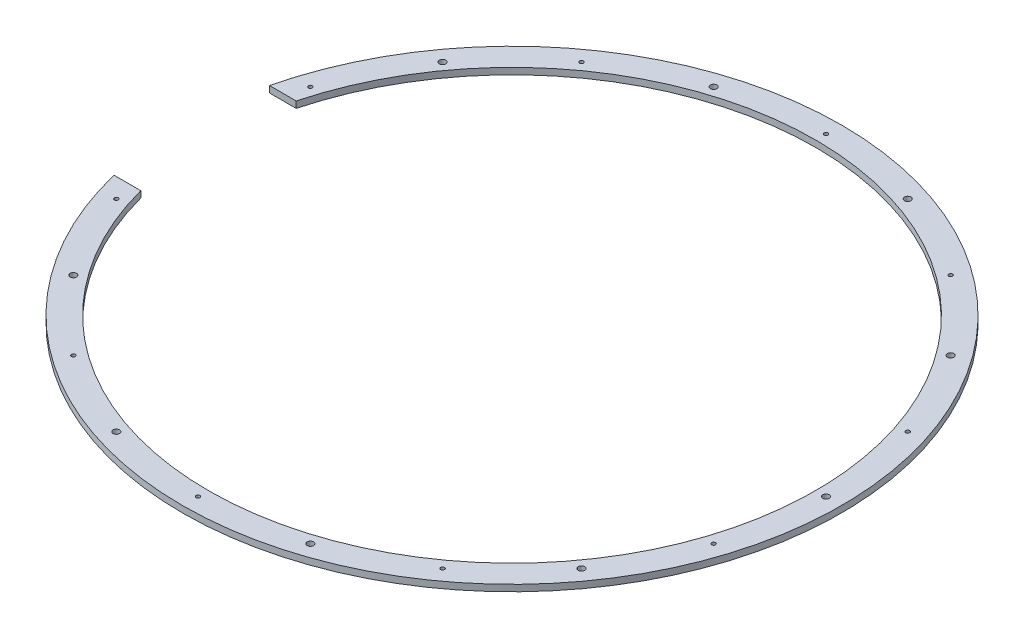
ISO-10303-21;
HEADER;
FILE_DESCRIPTION(('STEP AP214'),'2;1');
FILE_NAME('part.step','',(''),(''),'','','');
FILE_SCHEMA(('AUTOMOTIVE_DESIGN { 1 0 10303 214 1 1 1 1 }'));
ENDSEC;
DATA;
#1=APPLICATION_CONTEXT('core data for automotive mechanical design processes');
#2=APPLICATION_PROTOCOL_DEFINITION('international standard','automotive_design',2000,#1);
#3=PRODUCT_CONTEXT('',#1,'mechanical');
#4=PRODUCT('Part','Part','',(#3));
#5=PRODUCT_RELATED_PRODUCT_CATEGORY('part','',(#4));
#6=PRODUCT_DEFINITION_FORMATION('','',#4);
#7=PRODUCT_DEFINITION_CONTEXT('part definition',#1,'design');
#8=PRODUCT_DEFINITION('design','',#6,#7);
#9=PRODUCT_DEFINITION_SHAPE('','',#8);
#10=(LENGTH_UNIT() NAMED_UNIT(*) SI_UNIT(.MILLI.,.METRE.));
#11=(NAMED_UNIT(*) PLANE_ANGLE_UNIT() SI_UNIT($,.RADIAN.));
#12=(NAMED_UNIT(*) SI_UNIT($,.STERADIAN.) SOLID_ANGLE_UNIT());
#13=UNCERTAINTY_MEASURE_WITH_UNIT(LENGTH_MEASURE(1.E-05),#10,'distance_accuracy_value','');
#14=(GEOMETRIC_REPRESENTATION_CONTEXT(3) GLOBAL_UNCERTAINTY_ASSIGNED_CONTEXT((#13)) GLOBAL_UNIT_ASSIGNED_CONTEXT((#10,
#11,#12)) REPRESENTATION_CONTEXT('',''));
#15=CARTESIAN_POINT('',(0.,0.,0.));
#16=DIRECTION('',(0.,0.,1.));
#17=DIRECTION('',(1.,0.,0.));
#18=AXIS2_PLACEMENT_3D('',#15,#16,#17);
#19=CARTESIAN_POINT('',(0.,5.,0.));
#20=DIRECTION('',(0.,1.,0.));
#21=DIRECTION('',(0.,0.,1.));
#22=AXIS2_PLACEMENT_3D('',#19,#20,#21);
#23=PLANE('',#22);
#24=CARTESIAN_POINT('',(1.32132478297511E-11,5.,242.50000000001));
#25=DIRECTION('',(0.,1.,0.));
#26=DIRECTION('',(0.,0.,1.));
#27=AXIS2_PLACEMENT_3D('',#24,#25,#26);
#28=CIRCLE('',#27,1.49999999999059);
#29=CARTESIAN_POINT('',(1.32132478297511E-11,5.,244.));
#30=VERTEX_POINT('',#29);
#31=EDGE_CURVE('E206',#30,#30,#28,.T.);
#32=ORIENTED_EDGE('',*,*,#31,.F.);
#33=EDGE_LOOP('',(#32));
#34=FACE_BOUND('',#33,.T.);
#35=CARTESIAN_POINT('',(142.537923680936,5.,196.186621135929));
#36=DIRECTION('',(0.,1.,0.));
#37=DIRECTION('',(0.,0.,1.));
#38=AXIS2_PLACEMENT_3D('',#35,#36,#37);
#39=CIRCLE('',#38,1.4999999999906);
#40=CARTESIAN_POINT('',(142.537923680936,5.,197.686621135919));
#41=VERTEX_POINT('',#40);
#42=EDGE_CURVE('E161',#41,#41,#39,.T.);
#43=ORIENTED_EDGE('',*,*,#42,.F.);
#44=EDGE_LOOP('',(#43));
#45=FACE_BOUND('',#44,.T.);
#46=CARTESIAN_POINT('',(230.631205201581,5.,74.9366211359248));
#47=DIRECTION('',(0.,1.,0.));
#48=DIRECTION('',(0.,0.,1.));
#49=AXIS2_PLACEMENT_3D('',#46,#47,#48);
#50=CIRCLE('',#49,1.49999999999414);
#51=CARTESIAN_POINT('',(230.631205201581,5.,76.4366211359189));
#52=VERTEX_POINT('',#51);
#53=EDGE_CURVE('E160',#52,#52,#50,.T.);
#54=ORIENTED_EDGE('',*,*,#53,.F.);
#55=EDGE_LOOP('',(#54));
#56=FACE_BOUND('',#55,.T.);
#57=CARTESIAN_POINT('',(230.631205201575,5.,-74.9366211359248));
#58=DIRECTION('',(0.,1.,0.));
#59=DIRECTION('',(0.,0.,1.));
#60=AXIS2_PLACEMENT_3D('',#57,#58,#59);
#61=CIRCLE('',#60,1.5);
#62=CARTESIAN_POINT('',(230.631205201575,5.,-73.4366211359248));
#63=VERTEX_POINT('',#62);
#64=EDGE_CURVE('E167',#63,#63,#61,.T.);
#65=ORIENTED_EDGE('',*,*,#64,.F.);
#66=EDGE_LOOP('',(#65));
#67=FACE_BOUND('',#66,.T.);
#68=CARTESIAN_POINT('',(142.53792368092,5.,-196.186621135921));
#69=DIRECTION('',(0.,1.,0.));
#70=DIRECTION('',(0.,0.,1.));
#71=AXIS2_PLACEMENT_3D('',#68,#69,#70);
#72=CIRCLE('',#71,1.50000000000597);
#73=CARTESIAN_POINT('',(142.53792368092,5.,-194.686621135915));
#74=VERTEX_POINT('',#73);
#75=EDGE_CURVE('E173',#74,#74,#72,.T.);
#76=ORIENTED_EDGE('',*,*,#75,.F.);
#77=EDGE_LOOP('',(#76));
#78=FACE_BOUND('',#77,.T.);
#79=CARTESIAN_POINT('',(-7.07926561869708E-12,5.,-242.499999999991));
#80=DIRECTION('',(0.,1.,0.));
#81=DIRECTION('',(0.,0.,1.));
#82=AXIS2_PLACEMENT_3D('',#79,#80,#81);
#83=CIRCLE('',#82,1.50000000000972);
#84=CARTESIAN_POINT('',(-7.07926561869708E-12,5.,-240.999999999981));
#85=VERTEX_POINT('',#84);
#86=EDGE_CURVE('E179',#85,#85,#83,.T.);
#87=ORIENTED_EDGE('',*,*,#86,.F.);
#88=EDGE_LOOP('',(#87));
#89=FACE_BOUND('',#88,.T.);
#90=CARTESIAN_POINT('',(-142.53792368093,5.,-196.186621135909));
#91=DIRECTION('',(0.,1.,0.));
#92=DIRECTION('',(0.,0.,1.));
#93=AXIS2_PLACEMENT_3D('',#90,#91,#92);
#94=CIRCLE('',#93,1.50000000000975);
#95=CARTESIAN_POINT('',(-142.53792368093,5.,-194.6866211359));
#96=VERTEX_POINT('',#95);
#97=EDGE_CURVE('E185',#96,#96,#94,.T.);
#98=ORIENTED_EDGE('',*,*,#97,.F.);
#99=EDGE_LOOP('',(#98));
#100=FACE_BOUND('',#99,.T.);
#101=CARTESIAN_POINT('',(-230.631205201575,5.,-74.9366211359056));
#102=DIRECTION('',(0.,1.,0.));
#103=DIRECTION('',(0.,0.,1.));
#104=AXIS2_PLACEMENT_3D('',#101,#102,#103);
#105=CIRCLE('',#104,1.50000000000615);
#106=CARTESIAN_POINT('',(-230.631205201575,5.,-73.4366211358995));
#107=VERTEX_POINT('',#106);
#108=EDGE_CURVE('E191',#107,#107,#105,.T.);
#109=ORIENTED_EDGE('',*,*,#108,.F.);
#110=EDGE_LOOP('',(#109));
#111=FACE_BOUND('',#110,.T.);
#112=CARTESIAN_POINT('',(-230.631205201569,5.,74.936621135944));
#113=DIRECTION('',(0.,1.,0.));
#114=DIRECTION('',(0.,0.,1.));
#115=AXIS2_PLACEMENT_3D('',#112,#113,#114);
#116=CIRCLE('',#115,1.50000000000033);
#117=CARTESIAN_POINT('',(-230.631205201569,5.,76.4366211359443));
#118=VERTEX_POINT('',#117);
#119=EDGE_CURVE('E197',#118,#118,#116,.T.);
#120=ORIENTED_EDGE('',*,*,#119,.F.);
#121=EDGE_LOOP('',(#120));
#122=FACE_BOUND('',#121,.T.);
#123=CARTESIAN_POINT('',(-142.537923680914,5.,196.18662113594));
#124=DIRECTION('',(0.,1.,0.));
#125=DIRECTION('',(0.,0.,1.));
#126=AXIS2_PLACEMENT_3D('',#123,#124,#125);
#127=CIRCLE('',#126,1.49999999999442);
#128=CARTESIAN_POINT('',(-142.537923680914,5.,197.686621135935));
#129=VERTEX_POINT('',#128);
#130=EDGE_CURVE('E203',#129,#129,#127,.T.);
#131=ORIENTED_EDGE('',*,*,#130,.F.);
#132=EDGE_LOOP('',(#131));
#133=FACE_BOUND('',#132,.T.);
#134=CARTESIAN_POINT('',(242.5,5.,0.));
#135=DIRECTION('',(0.,1.,0.));
#136=DIRECTION('',(0.,0.,1.));
#137=AXIS2_PLACEMENT_3D('',#134,#135,#136);
#138=CIRCLE('',#137,2.5);
#139=CARTESIAN_POINT('',(242.5,5.,2.5));
#140=VERTEX_POINT('',#139);
#141=EDGE_CURVE('E146',#140,#140,#138,.T.);
#142=ORIENTED_EDGE('',*,*,#141,.F.);
#143=EDGE_LOOP('',(#142));
#144=FACE_BOUND('',#143,.T.);
#145=CARTESIAN_POINT('',(196.186621135925,5.,-142.537923680925));
#146=DIRECTION('',(0.,1.,0.));
#147=DIRECTION('',(0.,0.,1.));
#148=AXIS2_PLACEMENT_3D('',#145,#146,#147);
#149=CIRCLE('',#148,2.5);
#150=CARTESIAN_POINT('',(196.186621135925,5.,-140.037923680925));
#151=VERTEX_POINT('',#150);
#152=EDGE_CURVE('E147',#151,#151,#149,.T.);
#153=ORIENTED_EDGE('',*,*,#152,.F.);
#154=EDGE_LOOP('',(#153));
#155=FACE_BOUND('',#154,.T.);
#156=CARTESIAN_POINT('',(74.9366211359247,5.,-230.631205201575));
#157=DIRECTION('',(0.,1.,0.));
#158=DIRECTION('',(0.,0.,1.));
#159=AXIS2_PLACEMENT_3D('',#156,#157,#158);
#160=CIRCLE('',#159,2.50000000000001);
#161=CARTESIAN_POINT('',(74.9366211359247,5.,-228.131205201575));
#162=VERTEX_POINT('',#161);
#163=EDGE_CURVE('E103',#162,#162,#160,.T.);
#164=ORIENTED_EDGE('',*,*,#163,.F.);
#165=EDGE_LOOP('',(#164));
#166=FACE_BOUND('',#165,.T.);
#167=CARTESIAN_POINT('',(-74.9366211359248,5.,-230.631205201575));
#168=DIRECTION('',(0.,1.,0.));
#169=DIRECTION('',(0.,0.,1.));
#170=AXIS2_PLACEMENT_3D('',#167,#168,#169);
#171=CIRCLE('',#170,2.5);
#172=CARTESIAN_POINT('',(-74.9366211359248,5.,-228.131205201575));
#173=VERTEX_POINT('',#172);
#174=EDGE_CURVE('E110',#173,#173,#171,.T.);
#175=ORIENTED_EDGE('',*,*,#174,.F.);
#176=EDGE_LOOP('',(#175));
#177=FACE_BOUND('',#176,.T.);
#178=CARTESIAN_POINT('',(-196.186621135925,5.,-142.537923680925));
#179=DIRECTION('',(0.,1.,0.));
#180=DIRECTION('',(0.,0.,1.));
#181=AXIS2_PLACEMENT_3D('',#178,#179,#180);
#182=CIRCLE('',#181,2.5);
#183=CARTESIAN_POINT('',(-196.186621135925,5.,-140.037923680925));
#184=VERTEX_POINT('',#183);
#185=EDGE_CURVE('E116',#184,#184,#182,.T.);
#186=ORIENTED_EDGE('',*,*,#185,.F.);
#187=EDGE_LOOP('',(#186));
#188=FACE_BOUND('',#187,.T.);
#189=CARTESIAN_POINT('',(-196.186621135925,5.,142.537923680925));
#190=DIRECTION('',(0.,1.,0.));
#191=DIRECTION('',(0.,0.,1.));
#192=AXIS2_PLACEMENT_3D('',#189,#190,#191);
#193=CIRCLE('',#192,2.5);
#194=CARTESIAN_POINT('',(-196.186621135925,5.,145.037923680925));
#195=VERTEX_POINT('',#194);
#196=EDGE_CURVE('E122',#195,#195,#193,.T.);
#197=ORIENTED_EDGE('',*,*,#196,.F.);
#198=EDGE_LOOP('',(#197));
#199=FACE_BOUND('',#198,.T.);
#200=CARTESIAN_POINT('',(-74.9366211359248,5.,230.631205201575));
#201=DIRECTION('',(0.,1.,0.));
#202=DIRECTION('',(0.,0.,1.));
#203=AXIS2_PLACEMENT_3D('',#200,#201,#202);
#204=CIRCLE('',#203,2.5);
#205=CARTESIAN_POINT('',(-74.9366211359248,5.,233.131205201575));
#206=VERTEX_POINT('',#205);
#207=EDGE_CURVE('E128',#206,#206,#204,.T.);
#208=ORIENTED_EDGE('',*,*,#207,.F.);
#209=EDGE_LOOP('',(#208));
#210=FACE_BOUND('',#209,.T.);
#211=CARTESIAN_POINT('',(74.9366211359247,5.,230.631205201575));
#212=DIRECTION('',(0.,1.,0.));
#213=DIRECTION('',(0.,0.,1.));
#214=AXIS2_PLACEMENT_3D('',#211,#212,#213);
#215=CIRCLE('',#214,2.49999999999998);
#216=CARTESIAN_POINT('',(74.9366211359247,5.,233.131205201575));
#217=VERTEX_POINT('',#216);
#218=EDGE_CURVE('E134',#217,#217,#215,.T.);
#219=ORIENTED_EDGE('',*,*,#218,.F.);
#220=EDGE_LOOP('',(#219));
#221=FACE_BOUND('',#220,.T.);
#222=CARTESIAN_POINT('',(196.186621135925,5.,142.537923680925));
#223=DIRECTION('',(0.,1.,0.));
#224=DIRECTION('',(0.,0.,1.));
#225=AXIS2_PLACEMENT_3D('',#222,#223,#224);
#226=CIRCLE('',#225,2.50000000000002);
#227=CARTESIAN_POINT('',(196.186621135925,5.,145.037923680925));
#228=VERTEX_POINT('',#227);
#229=EDGE_CURVE('E140',#228,#228,#226,.T.);
#230=ORIENTED_EDGE('',*,*,#229,.F.);
#231=EDGE_LOOP('',(#230));
#232=FACE_BOUND('',#231,.T.);
#233=CARTESIAN_POINT('',(0.,5.,0.));
#234=DIRECTION('',(0.,1.,0.));
#235=DIRECTION('',(0.,0.,1.));
#236=AXIS2_PLACEMENT_3D('',#233,#234,#235);
#237=CIRCLE('',#236,234.5);
#238=CARTESIAN_POINT('',(-226.694177252086,5.,60.));
#239=VERTEX_POINT('',#238);
#240=CARTESIAN_POINT('',(-226.694177252086,5.,-60.));
#241=VERTEX_POINT('',#240);
#242=EDGE_CURVE('E87',#239,#241,#237,.T.);
#243=ORIENTED_EDGE('',*,*,#242,.F.);
#244=DIRECTION('',(-1.,0.,0.));
#245=VECTOR('',#244,1.);
#246=CARTESIAN_POINT('',(-226.694177252086,5.,60.));
#247=LINE('',#246,#245);
#248=CARTESIAN_POINT('',(-247.326201604278,5.,60.));
#249=VERTEX_POINT('',#248);
#250=EDGE_CURVE('E48',#239,#249,#247,.T.);
#251=ORIENTED_EDGE('',*,*,#250,.T.);
#252=CARTESIAN_POINT('',(0.,5.,0.));
#253=DIRECTION('',(0.,1.,0.));
#254=DIRECTION('',(0.,0.,1.));
#255=AXIS2_PLACEMENT_3D('',#252,#253,#254);
#256=CIRCLE('',#255,254.5);
#257=CARTESIAN_POINT('',(-247.326201604278,5.,-60.));
#258=VERTEX_POINT('',#257);
#259=EDGE_CURVE('E11',#249,#258,#256,.T.);
#260=ORIENTED_EDGE('',*,*,#259,.T.);
#261=DIRECTION('',(-1.,0.,0.));
#262=VECTOR('',#261,1.);
#263=CARTESIAN_POINT('',(-226.694177252086,5.,-60.));
#264=LINE('',#263,#262);
#265=EDGE_CURVE('E96',#241,#258,#264,.T.);
#266=ORIENTED_EDGE('',*,*,#265,.F.);
#267=EDGE_LOOP('',(#243,#251,#260,#266));
#268=FACE_BOUND('',#267,.T.);
#269=ADVANCED_FACE('F33',(#34,#45,#56,#67,#78,#89,#100,#111,#122,#133,#144,#155,#166,#177,#188,
#199,#210,#221,#232,#268),#23,.T.);
#270=CARTESIAN_POINT('',(0.,0.,0.));
#271=DIRECTION('',(0.,1.,0.));
#272=DIRECTION('',(0.,0.,1.));
#273=AXIS2_PLACEMENT_3D('',#270,#271,#272);
#274=PLANE('',#273);
#275=CARTESIAN_POINT('',(1.32132478297511E-11,0.,242.50000000001));
#276=DIRECTION('',(0.,1.,0.));
#277=DIRECTION('',(0.,0.,1.));
#278=AXIS2_PLACEMENT_3D('',#275,#276,#277);
#279=CIRCLE('',#278,1.49999999999059);
#280=CARTESIAN_POINT('',(1.32132478297511E-11,0.,244.));
#281=VERTEX_POINT('',#280);
#282=EDGE_CURVE('E150',#281,#281,#279,.T.);
#283=ORIENTED_EDGE('',*,*,#282,.T.);
#284=EDGE_LOOP('',(#283));
#285=FACE_BOUND('',#284,.T.);
#286=CARTESIAN_POINT('',(142.537923680936,0.,196.186621135929));
#287=DIRECTION('',(0.,1.,0.));
#288=DIRECTION('',(0.,0.,1.));
#289=AXIS2_PLACEMENT_3D('',#286,#287,#288);
#290=CIRCLE('',#289,1.4999999999906);
#291=CARTESIAN_POINT('',(142.537923680936,0.,197.686621135919));
#292=VERTEX_POINT('',#291);
#293=EDGE_CURVE('E207',#292,#292,#290,.T.);
#294=ORIENTED_EDGE('',*,*,#293,.T.);
#295=EDGE_LOOP('',(#294));
#296=FACE_BOUND('',#295,.T.);
#297=CARTESIAN_POINT('',(230.631205201581,0.,74.9366211359248));
#298=DIRECTION('',(0.,1.,0.));
#299=DIRECTION('',(0.,0.,1.));
#300=AXIS2_PLACEMENT_3D('',#297,#298,#299);
#301=CIRCLE('',#300,1.49999999999414);
#302=CARTESIAN_POINT('',(230.631205201581,0.,76.4366211359189));
#303=VERTEX_POINT('',#302);
#304=EDGE_CURVE('E157',#303,#303,#301,.T.);
#305=ORIENTED_EDGE('',*,*,#304,.T.);
#306=EDGE_LOOP('',(#305));
#307=FACE_BOUND('',#306,.T.);
#308=CARTESIAN_POINT('',(230.631205201575,0.,-74.9366211359248));
#309=DIRECTION('',(0.,1.,0.));
#310=DIRECTION('',(0.,0.,1.));
#311=AXIS2_PLACEMENT_3D('',#308,#309,#310);
#312=CIRCLE('',#311,1.5);
#313=CARTESIAN_POINT('',(230.631205201575,0.,-73.4366211359248));
#314=VERTEX_POINT('',#313);
#315=EDGE_CURVE('E164',#314,#314,#312,.T.);
#316=ORIENTED_EDGE('',*,*,#315,.T.);
#317=EDGE_LOOP('',(#316));
#318=FACE_BOUND('',#317,.T.);
#319=CARTESIAN_POINT('',(142.53792368092,0.,-196.186621135921));
#320=DIRECTION('',(0.,1.,0.));
#321=DIRECTION('',(0.,0.,1.));
#322=AXIS2_PLACEMENT_3D('',#319,#320,#321);
#323=CIRCLE('',#322,1.50000000000597);
#324=CARTESIAN_POINT('',(142.53792368092,0.,-194.686621135915));
#325=VERTEX_POINT('',#324);
#326=EDGE_CURVE('E170',#325,#325,#323,.T.);
#327=ORIENTED_EDGE('',*,*,#326,.T.);
#328=EDGE_LOOP('',(#327));
#329=FACE_BOUND('',#328,.T.);
#330=CARTESIAN_POINT('',(-7.07926561869708E-12,0.,-242.499999999991));
#331=DIRECTION('',(0.,1.,0.));
#332=DIRECTION('',(0.,0.,1.));
#333=AXIS2_PLACEMENT_3D('',#330,#331,#332);
#334=CIRCLE('',#333,1.50000000000972);
#335=CARTESIAN_POINT('',(-7.07926561869708E-12,0.,-240.999999999981));
#336=VERTEX_POINT('',#335);
#337=EDGE_CURVE('E176',#336,#336,#334,.T.);
#338=ORIENTED_EDGE('',*,*,#337,.T.);
#339=EDGE_LOOP('',(#338));
#340=FACE_BOUND('',#339,.T.);
#341=CARTESIAN_POINT('',(-142.53792368093,0.,-196.186621135909));
#342=DIRECTION('',(0.,1.,0.));
#343=DIRECTION('',(0.,0.,1.));
#344=AXIS2_PLACEMENT_3D('',#341,#342,#343);
#345=CIRCLE('',#344,1.50000000000975);
#346=CARTESIAN_POINT('',(-142.53792368093,0.,-194.6866211359));
#347=VERTEX_POINT('',#346);
#348=EDGE_CURVE('E182',#347,#347,#345,.T.);
#349=ORIENTED_EDGE('',*,*,#348,.T.);
#350=EDGE_LOOP('',(#349));
#351=FACE_BOUND('',#350,.T.);
#352=CARTESIAN_POINT('',(-230.631205201575,0.,-74.9366211359056));
#353=DIRECTION('',(0.,1.,0.));
#354=DIRECTION('',(0.,0.,1.));
#355=AXIS2_PLACEMENT_3D('',#352,#353,#354);
#356=CIRCLE('',#355,1.50000000000615);
#357=CARTESIAN_POINT('',(-230.631205201575,0.,-73.4366211358995));
#358=VERTEX_POINT('',#357);
#359=EDGE_CURVE('E188',#358,#358,#356,.T.);
#360=ORIENTED_EDGE('',*,*,#359,.T.);
#361=EDGE_LOOP('',(#360));
#362=FACE_BOUND('',#361,.T.);
#363=CARTESIAN_POINT('',(-230.631205201569,0.,74.936621135944));
#364=DIRECTION('',(0.,1.,0.));
#365=DIRECTION('',(0.,0.,1.));
#366=AXIS2_PLACEMENT_3D('',#363,#364,#365);
#367=CIRCLE('',#366,1.50000000000033);
#368=CARTESIAN_POINT('',(-230.631205201569,0.,76.4366211359443));
#369=VERTEX_POINT('',#368);
#370=EDGE_CURVE('E194',#369,#369,#367,.T.);
#371=ORIENTED_EDGE('',*,*,#370,.T.);
#372=EDGE_LOOP('',(#371));
#373=FACE_BOUND('',#372,.T.);
#374=CARTESIAN_POINT('',(-142.537923680914,0.,196.18662113594));
#375=DIRECTION('',(0.,1.,0.));
#376=DIRECTION('',(0.,0.,1.));
#377=AXIS2_PLACEMENT_3D('',#374,#375,#376);
#378=CIRCLE('',#377,1.49999999999442);
#379=CARTESIAN_POINT('',(-142.537923680914,0.,197.686621135935));
#380=VERTEX_POINT('',#379);
#381=EDGE_CURVE('E200',#380,#380,#378,.T.);
#382=ORIENTED_EDGE('',*,*,#381,.T.);
#383=EDGE_LOOP('',(#382));
#384=FACE_BOUND('',#383,.T.);
#385=CARTESIAN_POINT('',(242.5,0.,0.));
#386=DIRECTION('',(0.,1.,0.));
#387=DIRECTION('',(0.,0.,1.));
#388=AXIS2_PLACEMENT_3D('',#385,#386,#387);
#389=CIRCLE('',#388,2.5);
#390=CARTESIAN_POINT('',(242.5,0.,2.5));
#391=VERTEX_POINT('',#390);
#392=EDGE_CURVE('E101',#391,#391,#389,.T.);
#393=ORIENTED_EDGE('',*,*,#392,.T.);
#394=EDGE_LOOP('',(#393));
#395=FACE_BOUND('',#394,.T.);
#396=CARTESIAN_POINT('',(196.186621135925,0.,-142.537923680925));
#397=DIRECTION('',(0.,1.,0.));
#398=DIRECTION('',(0.,0.,1.));
#399=AXIS2_PLACEMENT_3D('',#396,#397,#398);
#400=CIRCLE('',#399,2.5);
#401=CARTESIAN_POINT('',(196.186621135925,0.,-140.037923680925));
#402=VERTEX_POINT('',#401);
#403=EDGE_CURVE('E107',#402,#402,#400,.T.);
#404=ORIENTED_EDGE('',*,*,#403,.T.);
#405=EDGE_LOOP('',(#404));
#406=FACE_BOUND('',#405,.T.);
#407=CARTESIAN_POINT('',(74.9366211359247,0.,-230.631205201575));
#408=DIRECTION('',(0.,1.,0.));
#409=DIRECTION('',(0.,0.,1.));
#410=AXIS2_PLACEMENT_3D('',#407,#408,#409);
#411=CIRCLE('',#410,2.50000000000001);
#412=CARTESIAN_POINT('',(74.9366211359247,0.,-228.131205201575));
#413=VERTEX_POINT('',#412);
#414=EDGE_CURVE('E106',#413,#413,#411,.T.);
#415=ORIENTED_EDGE('',*,*,#414,.T.);
#416=EDGE_LOOP('',(#415));
#417=FACE_BOUND('',#416,.T.);
#418=CARTESIAN_POINT('',(-74.9366211359248,0.,-230.631205201575));
#419=DIRECTION('',(0.,1.,0.));
#420=DIRECTION('',(0.,0.,1.));
#421=AXIS2_PLACEMENT_3D('',#418,#419,#420);
#422=CIRCLE('',#421,2.5);
#423=CARTESIAN_POINT('',(-74.9366211359248,0.,-228.131205201575));
#424=VERTEX_POINT('',#423);
#425=EDGE_CURVE('E113',#424,#424,#422,.T.);
#426=ORIENTED_EDGE('',*,*,#425,.T.);
#427=EDGE_LOOP('',(#426));
#428=FACE_BOUND('',#427,.T.);
#429=CARTESIAN_POINT('',(-196.186621135925,0.,-142.537923680925));
#430=DIRECTION('',(0.,1.,0.));
#431=DIRECTION('',(0.,0.,1.));
#432=AXIS2_PLACEMENT_3D('',#429,#430,#431);
#433=CIRCLE('',#432,2.5);
#434=CARTESIAN_POINT('',(-196.186621135925,0.,-140.037923680925));
#435=VERTEX_POINT('',#434);
#436=EDGE_CURVE('E119',#435,#435,#433,.T.);
#437=ORIENTED_EDGE('',*,*,#436,.T.);
#438=EDGE_LOOP('',(#437));
#439=FACE_BOUND('',#438,.T.);
#440=CARTESIAN_POINT('',(-196.186621135925,0.,142.537923680925));
#441=DIRECTION('',(0.,1.,0.));
#442=DIRECTION('',(0.,0.,1.));
#443=AXIS2_PLACEMENT_3D('',#440,#441,#442);
#444=CIRCLE('',#443,2.5);
#445=CARTESIAN_POINT('',(-196.186621135925,0.,145.037923680925));
#446=VERTEX_POINT('',#445);
#447=EDGE_CURVE('E125',#446,#446,#444,.T.);
#448=ORIENTED_EDGE('',*,*,#447,.T.);
#449=EDGE_LOOP('',(#448));
#450=FACE_BOUND('',#449,.T.);
#451=CARTESIAN_POINT('',(-74.9366211359248,0.,230.631205201575));
#452=DIRECTION('',(0.,1.,0.));
#453=DIRECTION('',(0.,0.,1.));
#454=AXIS2_PLACEMENT_3D('',#451,#452,#453);
#455=CIRCLE('',#454,2.5);
#456=CARTESIAN_POINT('',(-74.9366211359248,0.,233.131205201575));
#457=VERTEX_POINT('',#456);
#458=EDGE_CURVE('E131',#457,#457,#455,.T.);
#459=ORIENTED_EDGE('',*,*,#458,.T.);
#460=EDGE_LOOP('',(#459));
#461=FACE_BOUND('',#460,.T.);
#462=CARTESIAN_POINT('',(74.9366211359247,0.,230.631205201575));
#463=DIRECTION('',(0.,1.,0.));
#464=DIRECTION('',(0.,0.,1.));
#465=AXIS2_PLACEMENT_3D('',#462,#463,#464);
#466=CIRCLE('',#465,2.49999999999998);
#467=CARTESIAN_POINT('',(74.9366211359247,0.,233.131205201575));
#468=VERTEX_POINT('',#467);
#469=EDGE_CURVE('E137',#468,#468,#466,.T.);
#470=ORIENTED_EDGE('',*,*,#469,.T.);
#471=EDGE_LOOP('',(#470));
#472=FACE_BOUND('',#471,.T.);
#473=CARTESIAN_POINT('',(196.186621135925,0.,142.537923680925));
#474=DIRECTION('',(0.,1.,0.));
#475=DIRECTION('',(0.,0.,1.));
#476=AXIS2_PLACEMENT_3D('',#473,#474,#475);
#477=CIRCLE('',#476,2.50000000000002);
#478=CARTESIAN_POINT('',(196.186621135925,0.,145.037923680925));
#479=VERTEX_POINT('',#478);
#480=EDGE_CURVE('E143',#479,#479,#477,.T.);
#481=ORIENTED_EDGE('',*,*,#480,.T.);
#482=EDGE_LOOP('',(#481));
#483=FACE_BOUND('',#482,.T.);
#484=DIRECTION('',(-1.,0.,0.));
#485=VECTOR('',#484,1.);
#486=CARTESIAN_POINT('',(-226.694177252086,0.,60.));
#487=LINE('',#486,#485);
#488=CARTESIAN_POINT('',(-226.694177252086,0.,60.));
#489=VERTEX_POINT('',#488);
#490=CARTESIAN_POINT('',(-247.326201604278,0.,60.));
#491=VERTEX_POINT('',#490);
#492=EDGE_CURVE('E74',#489,#491,#487,.T.);
#493=ORIENTED_EDGE('',*,*,#492,.F.);
#494=CARTESIAN_POINT('',(0.,0.,0.));
#495=DIRECTION('',(0.,1.,0.));
#496=DIRECTION('',(0.,0.,1.));
#497=AXIS2_PLACEMENT_3D('',#494,#495,#496);
#498=CIRCLE('',#497,234.5);
#499=CARTESIAN_POINT('',(-226.694177252086,0.,-60.));
#500=VERTEX_POINT('',#499);
#501=EDGE_CURVE('E56',#489,#500,#498,.T.);
#502=ORIENTED_EDGE('',*,*,#501,.T.);
#503=DIRECTION('',(-1.,0.,0.));
#504=VECTOR('',#503,1.);
#505=CARTESIAN_POINT('',(-226.694177252086,0.,-60.));
#506=LINE('',#505,#504);
#507=CARTESIAN_POINT('',(-247.326201604278,0.,-60.));
#508=VERTEX_POINT('',#507);
#509=EDGE_CURVE('E95',#500,#508,#506,.T.);
#510=ORIENTED_EDGE('',*,*,#509,.T.);
#511=CARTESIAN_POINT('',(0.,0.,0.));
#512=DIRECTION('',(0.,1.,0.));
#513=DIRECTION('',(0.,0.,1.));
#514=AXIS2_PLACEMENT_3D('',#511,#512,#513);
#515=CIRCLE('',#514,254.5);
#516=EDGE_CURVE('E37',#491,#508,#515,.T.);
#517=ORIENTED_EDGE('',*,*,#516,.F.);
#518=EDGE_LOOP('',(#493,#502,#510,#517));
#519=FACE_BOUND('',#518,.T.);
#520=ADVANCED_FACE('F81',(#285,#296,#307,#318,#329,#340,#351,#362,#373,#384,#395,#406,#417,#428,
#439,#450,#461,#472,#483,#519),#274,.F.);
#521=CARTESIAN_POINT('',(0.,5.,0.));
#522=DIRECTION('',(0.,-1.,0.));
#523=DIRECTION('',(0.,0.,-1.));
#524=AXIS2_PLACEMENT_3D('',#521,#522,#523);
#525=CYLINDRICAL_SURFACE('',#524,254.5);
#526=DIRECTION('',(0.,-1.,0.));
#527=VECTOR('',#526,1.);
#528=CARTESIAN_POINT('',(-247.326201604278,5.,60.));
#529=LINE('',#528,#527);
#530=EDGE_CURVE('E78',#491,#249,#529,.F.);
#531=ORIENTED_EDGE('',*,*,#530,.F.);
#532=ORIENTED_EDGE('',*,*,#516,.T.);
#533=DIRECTION('',(0.,-1.,0.));
#534=VECTOR('',#533,1.);
#535=CARTESIAN_POINT('',(-247.326201604278,5.,-60.));
#536=LINE('',#535,#534);
#537=EDGE_CURVE('E88',#508,#258,#536,.F.);
#538=ORIENTED_EDGE('',*,*,#537,.T.);
#539=ORIENTED_EDGE('',*,*,#259,.F.);
#540=EDGE_LOOP('',(#531,#532,#538,#539));
#541=FACE_BOUND('',#540,.T.);
#542=ADVANCED_FACE('F35',(#541),#525,.T.);
#543=CARTESIAN_POINT('',(0.,5.,0.));
#544=DIRECTION('',(0.,-1.,0.));
#545=DIRECTION('',(0.,0.,-1.));
#546=AXIS2_PLACEMENT_3D('',#543,#544,#545);
#547=CYLINDRICAL_SURFACE('',#546,234.5);
#548=ORIENTED_EDGE('',*,*,#501,.F.);
#549=DIRECTION('',(0.,1.,0.));
#550=VECTOR('',#549,1.);
#551=CARTESIAN_POINT('',(-226.694177252086,0.,60.));
#552=LINE('',#551,#550);
#553=EDGE_CURVE('E72',#489,#239,#552,.T.);
#554=ORIENTED_EDGE('',*,*,#553,.T.);
#555=ORIENTED_EDGE('',*,*,#242,.T.);
#556=DIRECTION('',(0.,1.,0.));
#557=VECTOR('',#556,1.);
#558=CARTESIAN_POINT('',(-226.694177252086,0.,-60.));
#559=LINE('',#558,#557);
#560=EDGE_CURVE('E86',#500,#241,#559,.T.);
#561=ORIENTED_EDGE('',*,*,#560,.F.);
#562=EDGE_LOOP('',(#548,#554,#555,#561));
#563=FACE_BOUND('',#562,.T.);
#564=ADVANCED_FACE('F84',(#563),#547,.F.);
#565=CARTESIAN_POINT('',(-226.694177252086,0.,-60.));
#566=DIRECTION('',(0.,0.,-1.));
#567=DIRECTION('',(-1.,0.,0.));
#568=AXIS2_PLACEMENT_3D('',#565,#566,#567);
#569=PLANE('',#568);
#570=ORIENTED_EDGE('',*,*,#509,.F.);
#571=ORIENTED_EDGE('',*,*,#560,.T.);
#572=ORIENTED_EDGE('',*,*,#265,.T.);
#573=ORIENTED_EDGE('',*,*,#537,.F.);
#574=EDGE_LOOP('',(#570,#571,#572,#573));
#575=FACE_BOUND('',#574,.T.);
#576=ADVANCED_FACE('F268',(#575),#569,.F.);
#577=CARTESIAN_POINT('',(-226.694177252086,0.,60.));
#578=DIRECTION('',(0.,0.,-1.));
#579=DIRECTION('',(-1.,0.,0.));
#580=AXIS2_PLACEMENT_3D('',#577,#578,#579);
#581=PLANE('',#580);
#582=ORIENTED_EDGE('',*,*,#530,.T.);
#583=ORIENTED_EDGE('',*,*,#250,.F.);
#584=ORIENTED_EDGE('',*,*,#553,.F.);
#585=ORIENTED_EDGE('',*,*,#492,.T.);
#586=EDGE_LOOP('',(#582,#583,#584,#585));
#587=FACE_BOUND('',#586,.T.);
#588=ADVANCED_FACE('F73',(#587),#581,.T.);
#589=CARTESIAN_POINT('',(196.186621135925,0.,142.537923680925));
#590=DIRECTION('',(0.,1.,0.));
#591=DIRECTION('',(0.,0.,1.));
#592=AXIS2_PLACEMENT_3D('',#589,#590,#591);
#593=CYLINDRICAL_SURFACE('',#592,2.50000000000002);
#594=ORIENTED_EDGE('',*,*,#480,.F.);
#595=EDGE_LOOP('',(#594));
#596=FACE_BOUND('',#595,.T.);
#597=ORIENTED_EDGE('',*,*,#229,.T.);
#598=EDGE_LOOP('',(#597));
#599=FACE_BOUND('',#598,.T.);
#600=ADVANCED_FACE('F286',(#596,#599),#593,.F.);
#601=CARTESIAN_POINT('',(74.9366211359247,0.,230.631205201575));
#602=DIRECTION('',(0.,1.,0.));
#603=DIRECTION('',(0.,0.,1.));
#604=AXIS2_PLACEMENT_3D('',#601,#602,#603);
#605=CYLINDRICAL_SURFACE('',#604,2.49999999999998);
#606=ORIENTED_EDGE('',*,*,#469,.F.);
#607=EDGE_LOOP('',(#606));
#608=FACE_BOUND('',#607,.T.);
#609=ORIENTED_EDGE('',*,*,#218,.T.);
#610=EDGE_LOOP('',(#609));
#611=FACE_BOUND('',#610,.T.);
#612=ADVANCED_FACE('F307',(#608,#611),#605,.F.);
#613=CARTESIAN_POINT('',(-74.9366211359248,0.,230.631205201575));
#614=DIRECTION('',(0.,1.,0.));
#615=DIRECTION('',(0.,0.,1.));
#616=AXIS2_PLACEMENT_3D('',#613,#614,#615);
#617=CYLINDRICAL_SURFACE('',#616,2.5);
#618=ORIENTED_EDGE('',*,*,#458,.F.);
#619=EDGE_LOOP('',(#618));
#620=FACE_BOUND('',#619,.T.);
#621=ORIENTED_EDGE('',*,*,#207,.T.);
#622=EDGE_LOOP('',(#621));
#623=FACE_BOUND('',#622,.T.);
#624=ADVANCED_FACE('F303',(#620,#623),#617,.F.);
#625=CARTESIAN_POINT('',(-196.186621135925,0.,142.537923680925));
#626=DIRECTION('',(0.,1.,0.));
#627=DIRECTION('',(0.,0.,1.));
#628=AXIS2_PLACEMENT_3D('',#625,#626,#627);
#629=CYLINDRICAL_SURFACE('',#628,2.5);
#630=ORIENTED_EDGE('',*,*,#447,.F.);
#631=EDGE_LOOP('',(#630));
#632=FACE_BOUND('',#631,.T.);
#633=ORIENTED_EDGE('',*,*,#196,.T.);
#634=EDGE_LOOP('',(#633));
#635=FACE_BOUND('',#634,.T.);
#636=ADVANCED_FACE('F299',(#632,#635),#629,.F.);
#637=CARTESIAN_POINT('',(-196.186621135925,0.,-142.537923680925));
#638=DIRECTION('',(0.,1.,0.));
#639=DIRECTION('',(0.,0.,1.));
#640=AXIS2_PLACEMENT_3D('',#637,#638,#639);
#641=CYLINDRICAL_SURFACE('',#640,2.5);
#642=ORIENTED_EDGE('',*,*,#436,.F.);
#643=EDGE_LOOP('',(#642));
#644=FACE_BOUND('',#643,.T.);
#645=ORIENTED_EDGE('',*,*,#185,.T.);
#646=EDGE_LOOP('',(#645));
#647=FACE_BOUND('',#646,.T.);
#648=ADVANCED_FACE('F295',(#644,#647),#641,.F.);
#649=CARTESIAN_POINT('',(-74.9366211359248,0.,-230.631205201575));
#650=DIRECTION('',(0.,1.,0.));
#651=DIRECTION('',(0.,0.,1.));
#652=AXIS2_PLACEMENT_3D('',#649,#650,#651);
#653=CYLINDRICAL_SURFACE('',#652,2.5);
#654=ORIENTED_EDGE('',*,*,#425,.F.);
#655=EDGE_LOOP('',(#654));
#656=FACE_BOUND('',#655,.T.);
#657=ORIENTED_EDGE('',*,*,#174,.T.);
#658=EDGE_LOOP('',(#657));
#659=FACE_BOUND('',#658,.T.);
#660=ADVANCED_FACE('F291',(#656,#659),#653,.F.);
#661=CARTESIAN_POINT('',(74.9366211359247,0.,-230.631205201575));
#662=DIRECTION('',(0.,1.,0.));
#663=DIRECTION('',(0.,0.,1.));
#664=AXIS2_PLACEMENT_3D('',#661,#662,#663);
#665=CYLINDRICAL_SURFACE('',#664,2.50000000000001);
#666=ORIENTED_EDGE('',*,*,#414,.F.);
#667=EDGE_LOOP('',(#666));
#668=FACE_BOUND('',#667,.T.);
#669=ORIENTED_EDGE('',*,*,#163,.T.);
#670=EDGE_LOOP('',(#669));
#671=FACE_BOUND('',#670,.T.);
#672=ADVANCED_FACE('F287',(#668,#671),#665,.F.);
#673=CARTESIAN_POINT('',(196.186621135925,0.,-142.537923680925));
#674=DIRECTION('',(0.,1.,0.));
#675=DIRECTION('',(0.,0.,1.));
#676=AXIS2_PLACEMENT_3D('',#673,#674,#675);
#677=CYLINDRICAL_SURFACE('',#676,2.5);
#678=ORIENTED_EDGE('',*,*,#403,.F.);
#679=EDGE_LOOP('',(#678));
#680=FACE_BOUND('',#679,.T.);
#681=ORIENTED_EDGE('',*,*,#152,.T.);
#682=EDGE_LOOP('',(#681));
#683=FACE_BOUND('',#682,.T.);
#684=ADVANCED_FACE('F290',(#680,#683),#677,.F.);
#685=CARTESIAN_POINT('',(242.5,0.,0.));
#686=DIRECTION('',(0.,1.,0.));
#687=DIRECTION('',(0.,0.,1.));
#688=AXIS2_PLACEMENT_3D('',#685,#686,#687);
#689=CYLINDRICAL_SURFACE('',#688,2.5);
#690=ORIENTED_EDGE('',*,*,#392,.F.);
#691=EDGE_LOOP('',(#690));
#692=FACE_BOUND('',#691,.T.);
#693=ORIENTED_EDGE('',*,*,#141,.T.);
#694=EDGE_LOOP('',(#693));
#695=FACE_BOUND('',#694,.T.);
#696=ADVANCED_FACE('F317',(#692,#695),#689,.F.);
#697=CARTESIAN_POINT('',(-142.537923680914,0.,196.18662113594));
#698=DIRECTION('',(0.,1.,0.));
#699=DIRECTION('',(0.,0.,1.));
#700=AXIS2_PLACEMENT_3D('',#697,#698,#699);
#701=CYLINDRICAL_SURFACE('',#700,1.49999999999442);
#702=ORIENTED_EDGE('',*,*,#381,.F.);
#703=EDGE_LOOP('',(#702));
#704=FACE_BOUND('',#703,.T.);
#705=ORIENTED_EDGE('',*,*,#130,.T.);
#706=EDGE_LOOP('',(#705));
#707=FACE_BOUND('',#706,.T.);
#708=ADVANCED_FACE('F321',(#704,#707),#701,.F.);
#709=CARTESIAN_POINT('',(-230.631205201569,0.,74.936621135944));
#710=DIRECTION('',(0.,1.,0.));
#711=DIRECTION('',(0.,0.,1.));
#712=AXIS2_PLACEMENT_3D('',#709,#710,#711);
#713=CYLINDRICAL_SURFACE('',#712,1.50000000000033);
#714=ORIENTED_EDGE('',*,*,#370,.F.);
#715=EDGE_LOOP('',(#714));
#716=FACE_BOUND('',#715,.T.);
#717=ORIENTED_EDGE('',*,*,#119,.T.);
#718=EDGE_LOOP('',(#717));
#719=FACE_BOUND('',#718,.T.);
#720=ADVANCED_FACE('F346',(#716,#719),#713,.F.);
#721=CARTESIAN_POINT('',(-230.631205201575,0.,-74.9366211359056));
#722=DIRECTION('',(0.,1.,0.));
#723=DIRECTION('',(0.,0.,1.));
#724=AXIS2_PLACEMENT_3D('',#721,#722,#723);
#725=CYLINDRICAL_SURFACE('',#724,1.50000000000615);
#726=ORIENTED_EDGE('',*,*,#359,.F.);
#727=EDGE_LOOP('',(#726));
#728=FACE_BOUND('',#727,.T.);
#729=ORIENTED_EDGE('',*,*,#108,.T.);
#730=EDGE_LOOP('',(#729));
#731=FACE_BOUND('',#730,.T.);
#732=ADVANCED_FACE('F342',(#728,#731),#725,.F.);
#733=CARTESIAN_POINT('',(-142.53792368093,0.,-196.186621135909));
#734=DIRECTION('',(0.,1.,0.));
#735=DIRECTION('',(0.,0.,1.));
#736=AXIS2_PLACEMENT_3D('',#733,#734,#735);
#737=CYLINDRICAL_SURFACE('',#736,1.50000000000975);
#738=ORIENTED_EDGE('',*,*,#348,.F.);
#739=EDGE_LOOP('',(#738));
#740=FACE_BOUND('',#739,.T.);
#741=ORIENTED_EDGE('',*,*,#97,.T.);
#742=EDGE_LOOP('',(#741));
#743=FACE_BOUND('',#742,.T.);
#744=ADVANCED_FACE('F338',(#740,#743),#737,.F.);
#745=CARTESIAN_POINT('',(-7.07926561869708E-12,0.,-242.499999999991));
#746=DIRECTION('',(0.,1.,0.));
#747=DIRECTION('',(0.,0.,1.));
#748=AXIS2_PLACEMENT_3D('',#745,#746,#747);
#749=CYLINDRICAL_SURFACE('',#748,1.50000000000972);
#750=ORIENTED_EDGE('',*,*,#337,.F.);
#751=EDGE_LOOP('',(#750));
#752=FACE_BOUND('',#751,.T.);
#753=ORIENTED_EDGE('',*,*,#86,.T.);
#754=EDGE_LOOP('',(#753));
#755=FACE_BOUND('',#754,.T.);
#756=ADVANCED_FACE('F334',(#752,#755),#749,.F.);
#757=CARTESIAN_POINT('',(142.53792368092,0.,-196.186621135921));
#758=DIRECTION('',(0.,1.,0.));
#759=DIRECTION('',(0.,0.,1.));
#760=AXIS2_PLACEMENT_3D('',#757,#758,#759);
#761=CYLINDRICAL_SURFACE('',#760,1.50000000000597);
#762=ORIENTED_EDGE('',*,*,#326,.F.);
#763=EDGE_LOOP('',(#762));
#764=FACE_BOUND('',#763,.T.);
#765=ORIENTED_EDGE('',*,*,#75,.T.);
#766=EDGE_LOOP('',(#765));
#767=FACE_BOUND('',#766,.T.);
#768=ADVANCED_FACE('F330',(#764,#767),#761,.F.);
#769=CARTESIAN_POINT('',(230.631205201575,0.,-74.9366211359248));
#770=DIRECTION('',(0.,1.,0.));
#771=DIRECTION('',(0.,0.,1.));
#772=AXIS2_PLACEMENT_3D('',#769,#770,#771);
#773=CYLINDRICAL_SURFACE('',#772,1.5);
#774=ORIENTED_EDGE('',*,*,#315,.F.);
#775=EDGE_LOOP('',(#774));
#776=FACE_BOUND('',#775,.T.);
#777=ORIENTED_EDGE('',*,*,#64,.T.);
#778=EDGE_LOOP('',(#777));
#779=FACE_BOUND('',#778,.T.);
#780=ADVANCED_FACE('F326',(#776,#779),#773,.F.);
#781=CARTESIAN_POINT('',(230.631205201581,0.,74.9366211359248));
#782=DIRECTION('',(0.,1.,0.));
#783=DIRECTION('',(0.,0.,1.));
#784=AXIS2_PLACEMENT_3D('',#781,#782,#783);
#785=CYLINDRICAL_SURFACE('',#784,1.49999999999414);
#786=ORIENTED_EDGE('',*,*,#304,.F.);
#787=EDGE_LOOP('',(#786));
#788=FACE_BOUND('',#787,.T.);
#789=ORIENTED_EDGE('',*,*,#53,.T.);
#790=EDGE_LOOP('',(#789));
#791=FACE_BOUND('',#790,.T.);
#792=ADVANCED_FACE('F323',(#788,#791),#785,.F.);
#793=CARTESIAN_POINT('',(142.537923680936,0.,196.186621135929));
#794=DIRECTION('',(0.,1.,0.));
#795=DIRECTION('',(0.,0.,1.));
#796=AXIS2_PLACEMENT_3D('',#793,#794,#795);
#797=CYLINDRICAL_SURFACE('',#796,1.4999999999906);
#798=ORIENTED_EDGE('',*,*,#293,.F.);
#799=EDGE_LOOP('',(#798));
#800=FACE_BOUND('',#799,.T.);
#801=ORIENTED_EDGE('',*,*,#42,.T.);
#802=EDGE_LOOP('',(#801));
#803=FACE_BOUND('',#802,.T.);
#804=ADVANCED_FACE('F222',(#800,#803),#797,.F.);
#805=CARTESIAN_POINT('',(1.32132478297511E-11,0.,242.50000000001));
#806=DIRECTION('',(0.,1.,0.));
#807=DIRECTION('',(0.,0.,1.));
#808=AXIS2_PLACEMENT_3D('',#805,#806,#807);
#809=CYLINDRICAL_SURFACE('',#808,1.49999999999059);
#810=ORIENTED_EDGE('',*,*,#282,.F.);
#811=EDGE_LOOP('',(#810));
#812=FACE_BOUND('',#811,.T.);
#813=ORIENTED_EDGE('',*,*,#31,.T.);
#814=EDGE_LOOP('',(#813));
#815=FACE_BOUND('',#814,.T.);
#816=ADVANCED_FACE('F219',(#812,#815),#809,.F.);
#817=CLOSED_SHELL('',(#269,#520,#542,#564,#576,#588,#600,#612,#624,#636,#648,#660,#672,#684,
#696,#708,#720,#732,#744,#756,#768,#780,#792,#804,#816));
#818=MANIFOLD_SOLID_BREP('B2',#817);
#819=ADVANCED_BREP_SHAPE_REPRESENTATION('',(#18,#818),#14);
#820=SHAPE_DEFINITION_REPRESENTATION(#9,#819);
ENDSEC;
END-ISO-10303-21;
